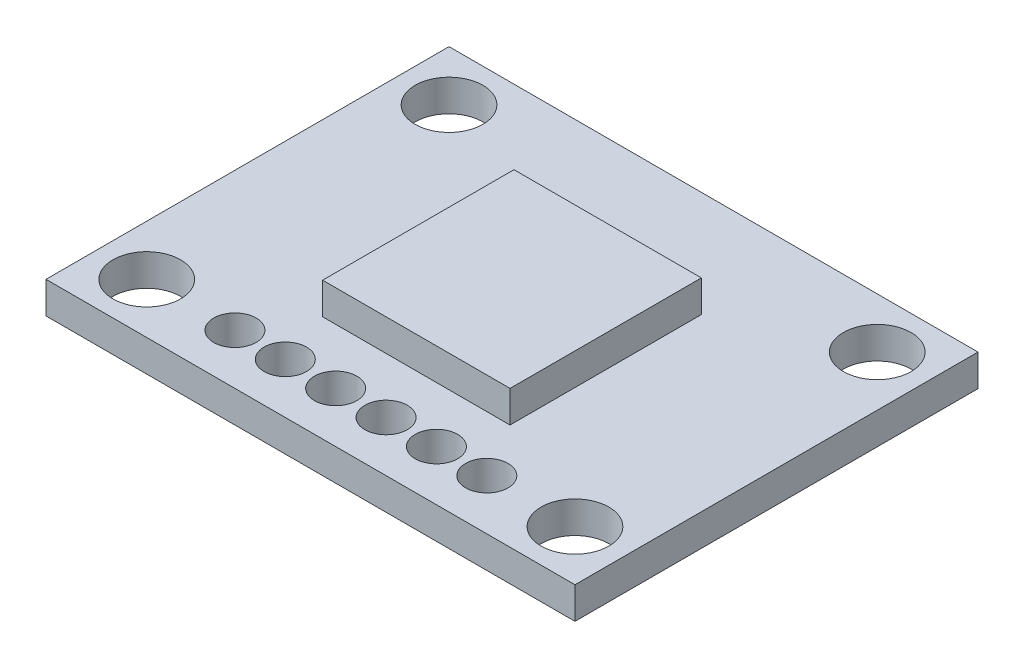
ISO-10303-21;
HEADER;
FILE_DESCRIPTION(('STEP AP214'),'2;1');
FILE_NAME('part.step','',(''),(''),'','','');
FILE_SCHEMA(('AUTOMOTIVE_DESIGN { 1 0 10303 214 1 1 1 1 }'));
ENDSEC;
DATA;
#1=APPLICATION_CONTEXT('core data for automotive mechanical design processes');
#2=APPLICATION_PROTOCOL_DEFINITION('international standard','automotive_design',2000,#1);
#3=PRODUCT_CONTEXT('',#1,'mechanical');
#4=PRODUCT('Part','Part','',(#3));
#5=PRODUCT_RELATED_PRODUCT_CATEGORY('part','',(#4));
#6=PRODUCT_DEFINITION_FORMATION('','',#4);
#7=PRODUCT_DEFINITION_CONTEXT('part definition',#1,'design');
#8=PRODUCT_DEFINITION('design','',#6,#7);
#9=PRODUCT_DEFINITION_SHAPE('','',#8);
#10=(LENGTH_UNIT() NAMED_UNIT(*) SI_UNIT(.MILLI.,.METRE.));
#11=(NAMED_UNIT(*) PLANE_ANGLE_UNIT() SI_UNIT($,.RADIAN.));
#12=(NAMED_UNIT(*) SI_UNIT($,.STERADIAN.) SOLID_ANGLE_UNIT());
#13=UNCERTAINTY_MEASURE_WITH_UNIT(LENGTH_MEASURE(1.E-05),#10,'distance_accuracy_value','');
#14=(GEOMETRIC_REPRESENTATION_CONTEXT(3) GLOBAL_UNCERTAINTY_ASSIGNED_CONTEXT((#13)) GLOBAL_UNIT_ASSIGNED_CONTEXT((#10,
#11,#12)) REPRESENTATION_CONTEXT('',''));
#15=CARTESIAN_POINT('',(0.,0.,0.));
#16=DIRECTION('',(0.,0.,1.));
#17=DIRECTION('',(1.,0.,0.));
#18=AXIS2_PLACEMENT_3D('',#15,#16,#17);
#19=CARTESIAN_POINT('',(0.,1.6,0.));
#20=DIRECTION('',(0.,-1.,0.));
#21=DIRECTION('',(0.,0.,-1.));
#22=AXIS2_PLACEMENT_3D('',#19,#20,#21);
#23=PLANE('',#22);
#24=CARTESIAN_POINT('',(1.27,1.6,7.61999999999999));
#25=DIRECTION('',(0.,1.,0.));
#26=DIRECTION('',(0.,0.,-1.));
#27=AXIS2_PLACEMENT_3D('',#24,#25,#26);
#28=CIRCLE('',#27,1.06997980980528);
#29=CARTESIAN_POINT('',(1.27,1.6,6.5500201901947));
#30=VERTEX_POINT('',#29);
#31=EDGE_CURVE('E122',#30,#30,#28,.T.);
#32=ORIENTED_EDGE('',*,*,#31,.F.);
#33=EDGE_LOOP('',(#32));
#34=FACE_BOUND('',#33,.T.);
#35=CARTESIAN_POINT('',(3.81,1.6,7.62));
#36=DIRECTION('',(0.,1.,0.));
#37=DIRECTION('',(0.,0.,-1.));
#38=AXIS2_PLACEMENT_3D('',#35,#36,#37);
#39=CIRCLE('',#38,1.06997980980528);
#40=CARTESIAN_POINT('',(3.81,1.6,6.55002019019472));
#41=VERTEX_POINT('',#40);
#42=EDGE_CURVE('E131',#41,#41,#39,.T.);
#43=ORIENTED_EDGE('',*,*,#42,.F.);
#44=EDGE_LOOP('',(#43));
#45=FACE_BOUND('',#44,.T.);
#46=CARTESIAN_POINT('',(-6.35,1.6,7.62000000000002));
#47=DIRECTION('',(0.,1.,0.));
#48=DIRECTION('',(0.,0.,1.));
#49=AXIS2_PLACEMENT_3D('',#46,#47,#48);
#50=CIRCLE('',#49,1.06997980980528);
#51=CARTESIAN_POINT('',(-6.35,1.6,8.6899798098053));
#52=VERTEX_POINT('',#51);
#53=EDGE_CURVE('E137',#52,#52,#50,.T.);
#54=ORIENTED_EDGE('',*,*,#53,.F.);
#55=EDGE_LOOP('',(#54));
#56=FACE_BOUND('',#55,.T.);
#57=CARTESIAN_POINT('',(-3.81,1.6,7.62));
#58=DIRECTION('',(0.,1.,0.));
#59=DIRECTION('',(0.,0.,1.));
#60=AXIS2_PLACEMENT_3D('',#57,#58,#59);
#61=CIRCLE('',#60,1.06997980980528);
#62=CARTESIAN_POINT('',(-3.81,1.6,8.68997980980529));
#63=VERTEX_POINT('',#62);
#64=EDGE_CURVE('E143',#63,#63,#61,.T.);
#65=ORIENTED_EDGE('',*,*,#64,.F.);
#66=EDGE_LOOP('',(#65));
#67=FACE_BOUND('',#66,.T.);
#68=CARTESIAN_POINT('',(6.35,1.6,7.62000000000002));
#69=DIRECTION('',(0.,1.,0.));
#70=DIRECTION('',(0.,0.,-1.));
#71=AXIS2_PLACEMENT_3D('',#68,#69,#70);
#72=CIRCLE('',#71,1.06997980980528);
#73=CARTESIAN_POINT('',(6.35,1.6,6.55002019019474));
#74=VERTEX_POINT('',#73);
#75=EDGE_CURVE('E149',#74,#74,#72,.T.);
#76=ORIENTED_EDGE('',*,*,#75,.F.);
#77=EDGE_LOOP('',(#76));
#78=FACE_BOUND('',#77,.T.);
#79=CARTESIAN_POINT('',(-1.27,1.6,7.61999999999999));
#80=DIRECTION('',(0.,1.,0.));
#81=DIRECTION('',(0.,0.,1.));
#82=AXIS2_PLACEMENT_3D('',#79,#80,#81);
#83=CIRCLE('',#82,1.06997980980528);
#84=CARTESIAN_POINT('',(-1.27,1.6,8.68997980980527));
#85=VERTEX_POINT('',#84);
#86=EDGE_CURVE('E155',#85,#85,#83,.T.);
#87=ORIENTED_EDGE('',*,*,#86,.F.);
#88=EDGE_LOOP('',(#87));
#89=FACE_BOUND('',#88,.T.);
#90=CARTESIAN_POINT('',(-10.795,1.6,7.61999999999999));
#91=DIRECTION('',(0.,1.,0.));
#92=DIRECTION('',(0.,0.,-1.));
#93=AXIS2_PLACEMENT_3D('',#90,#91,#92);
#94=CIRCLE('',#93,1.70781809242809);
#95=CARTESIAN_POINT('',(-10.795,1.6,5.91218190757189));
#96=VERTEX_POINT('',#95);
#97=EDGE_CURVE('E161',#96,#96,#94,.T.);
#98=ORIENTED_EDGE('',*,*,#97,.F.);
#99=EDGE_LOOP('',(#98));
#100=FACE_BOUND('',#99,.T.);
#101=CARTESIAN_POINT('',(10.795,1.6,7.62));
#102=DIRECTION('',(0.,1.,0.));
#103=DIRECTION('',(0.,0.,1.));
#104=AXIS2_PLACEMENT_3D('',#101,#102,#103);
#105=CIRCLE('',#104,1.70781809242809);
#106=CARTESIAN_POINT('',(10.795,1.6,9.32781809242809));
#107=VERTEX_POINT('',#106);
#108=EDGE_CURVE('E167',#107,#107,#105,.T.);
#109=ORIENTED_EDGE('',*,*,#108,.F.);
#110=EDGE_LOOP('',(#109));
#111=FACE_BOUND('',#110,.T.);
#112=CARTESIAN_POINT('',(10.795,1.6,-7.62));
#113=DIRECTION('',(0.,1.,0.));
#114=DIRECTION('',(0.,0.,-1.));
#115=AXIS2_PLACEMENT_3D('',#112,#113,#114);
#116=CIRCLE('',#115,1.70781809242809);
#117=CARTESIAN_POINT('',(10.795,1.6,-9.32781809242809));
#118=VERTEX_POINT('',#117);
#119=EDGE_CURVE('E173',#118,#118,#116,.T.);
#120=ORIENTED_EDGE('',*,*,#119,.F.);
#121=EDGE_LOOP('',(#120));
#122=FACE_BOUND('',#121,.T.);
#123=CARTESIAN_POINT('',(-10.795,1.6,-7.62));
#124=DIRECTION('',(0.,1.,0.));
#125=DIRECTION('',(0.,0.,1.));
#126=AXIS2_PLACEMENT_3D('',#123,#124,#125);
#127=CIRCLE('',#126,1.70781809242809);
#128=CARTESIAN_POINT('',(-10.795,1.6,-5.91218190757191));
#129=VERTEX_POINT('',#128);
#130=EDGE_CURVE('E179',#129,#129,#127,.T.);
#131=ORIENTED_EDGE('',*,*,#130,.F.);
#132=EDGE_LOOP('',(#131));
#133=FACE_BOUND('',#132,.T.);
#134=DIRECTION('',(0.,0.,-1.));
#135=VECTOR('',#134,1.);
#136=CARTESIAN_POINT('',(13.335,1.6,10.16));
#137=LINE('',#136,#135);
#138=CARTESIAN_POINT('',(13.335,1.6,10.16));
#139=VERTEX_POINT('',#138);
#140=CARTESIAN_POINT('',(13.335,1.6,-10.16));
#141=VERTEX_POINT('',#140);
#142=EDGE_CURVE('E185',#139,#141,#137,.T.);
#143=ORIENTED_EDGE('',*,*,#142,.T.);
#144=DIRECTION('',(-1.,0.,0.));
#145=VECTOR('',#144,1.);
#146=CARTESIAN_POINT('',(-13.335,1.6,-10.16));
#147=LINE('',#146,#145);
#148=CARTESIAN_POINT('',(-13.335,1.6,-10.16));
#149=VERTEX_POINT('',#148);
#150=EDGE_CURVE('E188',#141,#149,#147,.T.);
#151=ORIENTED_EDGE('',*,*,#150,.T.);
#152=DIRECTION('',(0.,0.,1.));
#153=VECTOR('',#152,1.);
#154=CARTESIAN_POINT('',(-13.335,1.6,10.16));
#155=LINE('',#154,#153);
#156=CARTESIAN_POINT('',(-13.335,1.6,10.16));
#157=VERTEX_POINT('',#156);
#158=EDGE_CURVE('E191',#149,#157,#155,.T.);
#159=ORIENTED_EDGE('',*,*,#158,.T.);
#160=DIRECTION('',(1.,0.,0.));
#161=VECTOR('',#160,1.);
#162=CARTESIAN_POINT('',(-13.335,1.6,10.16));
#163=LINE('',#162,#161);
#164=EDGE_CURVE('E193',#157,#139,#163,.T.);
#165=ORIENTED_EDGE('',*,*,#164,.T.);
#166=EDGE_LOOP('',(#143,#151,#159,#165));
#167=FACE_BOUND('',#166,.T.);
#168=DIRECTION('',(0.,0.,-1.));
#169=VECTOR('',#168,1.);
#170=CARTESIAN_POINT('',(4.72486367333325,1.6,4.82363423025589));
#171=LINE('',#170,#169);
#172=CARTESIAN_POINT('',(4.72486367333325,1.6,4.82363423025589));
#173=VERTEX_POINT('',#172);
#174=CARTESIAN_POINT('',(4.72486367333325,1.6,-4.82363423025589));
#175=VERTEX_POINT('',#174);
#176=EDGE_CURVE('E49',#173,#175,#171,.T.);
#177=ORIENTED_EDGE('',*,*,#176,.F.);
#178=DIRECTION('',(1.,0.,0.));
#179=VECTOR('',#178,1.);
#180=CARTESIAN_POINT('',(-4.72486367333325,1.6,4.82363423025589));
#181=LINE('',#180,#179);
#182=CARTESIAN_POINT('',(-4.72486367333325,1.6,4.82363423025589));
#183=VERTEX_POINT('',#182);
#184=EDGE_CURVE('E53',#183,#173,#181,.T.);
#185=ORIENTED_EDGE('',*,*,#184,.F.);
#186=DIRECTION('',(0.,0.,1.));
#187=VECTOR('',#186,1.);
#188=CARTESIAN_POINT('',(-4.72486367333325,1.6,4.82363423025589));
#189=LINE('',#188,#187);
#190=CARTESIAN_POINT('',(-4.72486367333325,1.6,-4.82363423025589));
#191=VERTEX_POINT('',#190);
#192=EDGE_CURVE('E432',#191,#183,#189,.T.);
#193=ORIENTED_EDGE('',*,*,#192,.F.);
#194=DIRECTION('',(-1.,0.,0.));
#195=VECTOR('',#194,1.);
#196=CARTESIAN_POINT('',(-4.72486367333325,1.6,-4.82363423025589));
#197=LINE('',#196,#195);
#198=EDGE_CURVE('E438',#175,#191,#197,.T.);
#199=ORIENTED_EDGE('',*,*,#198,.F.);
#200=EDGE_LOOP('',(#177,#185,#193,#199));
#201=FACE_BOUND('',#200,.T.);
#202=ADVANCED_FACE('F34',(#34,#45,#56,#67,#78,#89,#100,#111,#122,#133,#167,#201),#23,.F.);
#203=CARTESIAN_POINT('',(0.,0.,0.));
#204=DIRECTION('',(0.,-1.,0.));
#205=DIRECTION('',(0.,0.,-1.));
#206=AXIS2_PLACEMENT_3D('',#203,#204,#205);
#207=PLANE('',#206);
#208=CARTESIAN_POINT('',(3.81,0.,7.62));
#209=DIRECTION('',(0.,1.,0.));
#210=DIRECTION('',(0.,0.,-1.));
#211=AXIS2_PLACEMENT_3D('',#208,#209,#210);
#212=CIRCLE('',#211,1.06997980980528);
#213=CARTESIAN_POINT('',(3.81,0.,6.55002019019472));
#214=VERTEX_POINT('',#213);
#215=EDGE_CURVE('E129',#214,#214,#212,.T.);
#216=ORIENTED_EDGE('',*,*,#215,.T.);
#217=EDGE_LOOP('',(#216));
#218=FACE_BOUND('',#217,.T.);
#219=CARTESIAN_POINT('',(-3.81,0.,7.62));
#220=DIRECTION('',(0.,1.,0.));
#221=DIRECTION('',(0.,0.,1.));
#222=AXIS2_PLACEMENT_3D('',#219,#220,#221);
#223=CIRCLE('',#222,1.06997980980528);
#224=CARTESIAN_POINT('',(-3.81,0.,8.68997980980529));
#225=VERTEX_POINT('',#224);
#226=EDGE_CURVE('E140',#225,#225,#223,.T.);
#227=ORIENTED_EDGE('',*,*,#226,.T.);
#228=EDGE_LOOP('',(#227));
#229=FACE_BOUND('',#228,.T.);
#230=CARTESIAN_POINT('',(-1.27,0.,7.61999999999999));
#231=DIRECTION('',(0.,1.,0.));
#232=DIRECTION('',(0.,0.,1.));
#233=AXIS2_PLACEMENT_3D('',#230,#231,#232);
#234=CIRCLE('',#233,1.06997980980528);
#235=CARTESIAN_POINT('',(-1.27,0.,8.68997980980527));
#236=VERTEX_POINT('',#235);
#237=EDGE_CURVE('E152',#236,#236,#234,.T.);
#238=ORIENTED_EDGE('',*,*,#237,.T.);
#239=EDGE_LOOP('',(#238));
#240=FACE_BOUND('',#239,.T.);
#241=CARTESIAN_POINT('',(10.795,0.,7.62));
#242=DIRECTION('',(0.,1.,0.));
#243=DIRECTION('',(0.,0.,1.));
#244=AXIS2_PLACEMENT_3D('',#241,#242,#243);
#245=CIRCLE('',#244,1.70781809242809);
#246=CARTESIAN_POINT('',(10.795,0.,9.32781809242809));
#247=VERTEX_POINT('',#246);
#248=EDGE_CURVE('E164',#247,#247,#245,.T.);
#249=ORIENTED_EDGE('',*,*,#248,.T.);
#250=EDGE_LOOP('',(#249));
#251=FACE_BOUND('',#250,.T.);
#252=CARTESIAN_POINT('',(-10.795,0.,-7.62));
#253=DIRECTION('',(0.,1.,0.));
#254=DIRECTION('',(0.,0.,1.));
#255=AXIS2_PLACEMENT_3D('',#252,#253,#254);
#256=CIRCLE('',#255,1.70781809242809);
#257=CARTESIAN_POINT('',(-10.795,0.,-5.91218190757191));
#258=VERTEX_POINT('',#257);
#259=EDGE_CURVE('E176',#258,#258,#256,.T.);
#260=ORIENTED_EDGE('',*,*,#259,.T.);
#261=EDGE_LOOP('',(#260));
#262=FACE_BOUND('',#261,.T.);
#263=DIRECTION('',(0.,0.,-1.));
#264=VECTOR('',#263,1.);
#265=CARTESIAN_POINT('',(13.335,0.,10.16));
#266=LINE('',#265,#264);
#267=CARTESIAN_POINT('',(13.335,0.,10.16));
#268=VERTEX_POINT('',#267);
#269=CARTESIAN_POINT('',(13.335,0.,-10.16));
#270=VERTEX_POINT('',#269);
#271=EDGE_CURVE('E182',#268,#270,#266,.T.);
#272=ORIENTED_EDGE('',*,*,#271,.F.);
#273=DIRECTION('',(1.,0.,0.));
#274=VECTOR('',#273,1.);
#275=CARTESIAN_POINT('',(-13.335,0.,10.16));
#276=LINE('',#275,#274);
#277=CARTESIAN_POINT('',(-13.335,0.,10.16));
#278=VERTEX_POINT('',#277);
#279=EDGE_CURVE('E189',#278,#268,#276,.T.);
#280=ORIENTED_EDGE('',*,*,#279,.F.);
#281=DIRECTION('',(0.,0.,1.));
#282=VECTOR('',#281,1.);
#283=CARTESIAN_POINT('',(-13.335,0.,10.16));
#284=LINE('',#283,#282);
#285=CARTESIAN_POINT('',(-13.335,0.,-10.16));
#286=VERTEX_POINT('',#285);
#287=EDGE_CURVE('E200',#286,#278,#284,.T.);
#288=ORIENTED_EDGE('',*,*,#287,.F.);
#289=DIRECTION('',(-1.,0.,0.));
#290=VECTOR('',#289,1.);
#291=CARTESIAN_POINT('',(-13.335,0.,-10.16));
#292=LINE('',#291,#290);
#293=EDGE_CURVE('E198',#270,#286,#292,.T.);
#294=ORIENTED_EDGE('',*,*,#293,.F.);
#295=EDGE_LOOP('',(#272,#280,#288,#294));
#296=FACE_BOUND('',#295,.T.);
#297=CARTESIAN_POINT('',(10.795,0.,-7.62));
#298=DIRECTION('',(0.,1.,0.));
#299=DIRECTION('',(0.,0.,-1.));
#300=AXIS2_PLACEMENT_3D('',#297,#298,#299);
#301=CIRCLE('',#300,1.70781809242809);
#302=CARTESIAN_POINT('',(10.795,0.,-9.32781809242809));
#303=VERTEX_POINT('',#302);
#304=EDGE_CURVE('E170',#303,#303,#301,.T.);
#305=ORIENTED_EDGE('',*,*,#304,.T.);
#306=EDGE_LOOP('',(#305));
#307=FACE_BOUND('',#306,.T.);
#308=CARTESIAN_POINT('',(-10.795,0.,7.61999999999999));
#309=DIRECTION('',(0.,1.,0.));
#310=DIRECTION('',(0.,0.,-1.));
#311=AXIS2_PLACEMENT_3D('',#308,#309,#310);
#312=CIRCLE('',#311,1.70781809242809);
#313=CARTESIAN_POINT('',(-10.795,0.,5.91218190757189));
#314=VERTEX_POINT('',#313);
#315=EDGE_CURVE('E158',#314,#314,#312,.T.);
#316=ORIENTED_EDGE('',*,*,#315,.T.);
#317=EDGE_LOOP('',(#316));
#318=FACE_BOUND('',#317,.T.);
#319=CARTESIAN_POINT('',(6.35,0.,7.62000000000002));
#320=DIRECTION('',(0.,1.,0.));
#321=DIRECTION('',(0.,0.,-1.));
#322=AXIS2_PLACEMENT_3D('',#319,#320,#321);
#323=CIRCLE('',#322,1.06997980980528);
#324=CARTESIAN_POINT('',(6.35,0.,6.55002019019474));
#325=VERTEX_POINT('',#324);
#326=EDGE_CURVE('E146',#325,#325,#323,.T.);
#327=ORIENTED_EDGE('',*,*,#326,.T.);
#328=EDGE_LOOP('',(#327));
#329=FACE_BOUND('',#328,.T.);
#330=CARTESIAN_POINT('',(-6.35,0.,7.62000000000002));
#331=DIRECTION('',(0.,1.,0.));
#332=DIRECTION('',(0.,0.,1.));
#333=AXIS2_PLACEMENT_3D('',#330,#331,#332);
#334=CIRCLE('',#333,1.06997980980528);
#335=CARTESIAN_POINT('',(-6.35,0.,8.6899798098053));
#336=VERTEX_POINT('',#335);
#337=EDGE_CURVE('E134',#336,#336,#334,.T.);
#338=ORIENTED_EDGE('',*,*,#337,.T.);
#339=EDGE_LOOP('',(#338));
#340=FACE_BOUND('',#339,.T.);
#341=CARTESIAN_POINT('',(1.27,0.,7.61999999999999));
#342=DIRECTION('',(0.,1.,0.));
#343=DIRECTION('',(0.,0.,-1.));
#344=AXIS2_PLACEMENT_3D('',#341,#342,#343);
#345=CIRCLE('',#344,1.06997980980528);
#346=CARTESIAN_POINT('',(1.27,0.,6.5500201901947));
#347=VERTEX_POINT('',#346);
#348=EDGE_CURVE('E119',#347,#347,#345,.T.);
#349=ORIENTED_EDGE('',*,*,#348,.T.);
#350=EDGE_LOOP('',(#349));
#351=FACE_BOUND('',#350,.T.);
#352=ADVANCED_FACE('F218',(#218,#229,#240,#251,#262,#296,#307,#318,#329,#340,#351),#207,.T.);
#353=CARTESIAN_POINT('',(13.335,1.6,10.16));
#354=DIRECTION('',(-1.,0.,0.));
#355=DIRECTION('',(0.,0.,1.));
#356=AXIS2_PLACEMENT_3D('',#353,#354,#355);
#357=PLANE('',#356);
#358=ORIENTED_EDGE('',*,*,#271,.T.);
#359=DIRECTION('',(0.,-1.,0.));
#360=VECTOR('',#359,1.);
#361=CARTESIAN_POINT('',(13.335,1.6,-10.16));
#362=LINE('',#361,#360);
#363=EDGE_CURVE('E11',#141,#270,#362,.T.);
#364=ORIENTED_EDGE('',*,*,#363,.F.);
#365=ORIENTED_EDGE('',*,*,#142,.F.);
#366=DIRECTION('',(0.,-1.,0.));
#367=VECTOR('',#366,1.);
#368=CARTESIAN_POINT('',(13.335,1.6,10.16));
#369=LINE('',#368,#367);
#370=EDGE_CURVE('E195',#139,#268,#369,.T.);
#371=ORIENTED_EDGE('',*,*,#370,.T.);
#372=EDGE_LOOP('',(#358,#364,#365,#371));
#373=FACE_BOUND('',#372,.T.);
#374=ADVANCED_FACE('F36',(#373),#357,.F.);
#375=CARTESIAN_POINT('',(-13.335,1.6,-10.16));
#376=DIRECTION('',(0.,0.,1.));
#377=DIRECTION('',(1.,0.,0.));
#378=AXIS2_PLACEMENT_3D('',#375,#376,#377);
#379=PLANE('',#378);
#380=ORIENTED_EDGE('',*,*,#293,.T.);
#381=DIRECTION('',(0.,-1.,0.));
#382=VECTOR('',#381,1.);
#383=CARTESIAN_POINT('',(-13.335,1.6,-10.16));
#384=LINE('',#383,#382);
#385=EDGE_CURVE('E42',#149,#286,#384,.T.);
#386=ORIENTED_EDGE('',*,*,#385,.F.);
#387=ORIENTED_EDGE('',*,*,#150,.F.);
#388=ORIENTED_EDGE('',*,*,#363,.T.);
#389=EDGE_LOOP('',(#380,#386,#387,#388));
#390=FACE_BOUND('',#389,.T.);
#391=ADVANCED_FACE('F228',(#390),#379,.F.);
#392=CARTESIAN_POINT('',(-13.335,1.6,10.16));
#393=DIRECTION('',(1.,0.,0.));
#394=DIRECTION('',(0.,0.,-1.));
#395=AXIS2_PLACEMENT_3D('',#392,#393,#394);
#396=PLANE('',#395);
#397=ORIENTED_EDGE('',*,*,#287,.T.);
#398=DIRECTION('',(0.,-1.,0.));
#399=VECTOR('',#398,1.);
#400=CARTESIAN_POINT('',(-13.335,1.6,10.16));
#401=LINE('',#400,#399);
#402=EDGE_CURVE('E205',#157,#278,#401,.T.);
#403=ORIENTED_EDGE('',*,*,#402,.F.);
#404=ORIENTED_EDGE('',*,*,#158,.F.);
#405=ORIENTED_EDGE('',*,*,#385,.T.);
#406=EDGE_LOOP('',(#397,#403,#404,#405));
#407=FACE_BOUND('',#406,.T.);
#408=ADVANCED_FACE('F212',(#407),#396,.F.);
#409=CARTESIAN_POINT('',(-13.335,1.6,10.16));
#410=DIRECTION('',(0.,0.,-1.));
#411=DIRECTION('',(-1.,0.,0.));
#412=AXIS2_PLACEMENT_3D('',#409,#410,#411);
#413=PLANE('',#412);
#414=ORIENTED_EDGE('',*,*,#279,.T.);
#415=ORIENTED_EDGE('',*,*,#370,.F.);
#416=ORIENTED_EDGE('',*,*,#164,.F.);
#417=ORIENTED_EDGE('',*,*,#402,.T.);
#418=EDGE_LOOP('',(#414,#415,#416,#417));
#419=FACE_BOUND('',#418,.T.);
#420=ADVANCED_FACE('F222',(#419),#413,.F.);
#421=CARTESIAN_POINT('',(-10.795,1.6,-7.62));
#422=DIRECTION('',(0.,-1.,0.));
#423=DIRECTION('',(0.,0.,-1.));
#424=AXIS2_PLACEMENT_3D('',#421,#422,#423);
#425=CYLINDRICAL_SURFACE('',#424,1.70781809242809);
#426=ORIENTED_EDGE('',*,*,#130,.T.);
#427=EDGE_LOOP('',(#426));
#428=FACE_BOUND('',#427,.T.);
#429=ORIENTED_EDGE('',*,*,#259,.F.);
#430=EDGE_LOOP('',(#429));
#431=FACE_BOUND('',#430,.T.);
#432=ADVANCED_FACE('F246',(#428,#431),#425,.F.);
#433=CARTESIAN_POINT('',(10.795,1.6,-7.62));
#434=DIRECTION('',(0.,-1.,0.));
#435=DIRECTION('',(0.,0.,-1.));
#436=AXIS2_PLACEMENT_3D('',#433,#434,#435);
#437=CYLINDRICAL_SURFACE('',#436,1.70781809242809);
#438=ORIENTED_EDGE('',*,*,#119,.T.);
#439=EDGE_LOOP('',(#438));
#440=FACE_BOUND('',#439,.T.);
#441=ORIENTED_EDGE('',*,*,#304,.F.);
#442=EDGE_LOOP('',(#441));
#443=FACE_BOUND('',#442,.T.);
#444=ADVANCED_FACE('F253',(#440,#443),#437,.F.);
#445=CARTESIAN_POINT('',(10.795,1.6,7.62));
#446=DIRECTION('',(0.,-1.,0.));
#447=DIRECTION('',(0.,0.,-1.));
#448=AXIS2_PLACEMENT_3D('',#445,#446,#447);
#449=CYLINDRICAL_SURFACE('',#448,1.70781809242809);
#450=ORIENTED_EDGE('',*,*,#108,.T.);
#451=EDGE_LOOP('',(#450));
#452=FACE_BOUND('',#451,.T.);
#453=ORIENTED_EDGE('',*,*,#248,.F.);
#454=EDGE_LOOP('',(#453));
#455=FACE_BOUND('',#454,.T.);
#456=ADVANCED_FACE('F258',(#452,#455),#449,.F.);
#457=CARTESIAN_POINT('',(-10.795,1.6,7.61999999999999));
#458=DIRECTION('',(0.,-1.,0.));
#459=DIRECTION('',(0.,0.,-1.));
#460=AXIS2_PLACEMENT_3D('',#457,#458,#459);
#461=CYLINDRICAL_SURFACE('',#460,1.70781809242809);
#462=ORIENTED_EDGE('',*,*,#97,.T.);
#463=EDGE_LOOP('',(#462));
#464=FACE_BOUND('',#463,.T.);
#465=ORIENTED_EDGE('',*,*,#315,.F.);
#466=EDGE_LOOP('',(#465));
#467=FACE_BOUND('',#466,.T.);
#468=ADVANCED_FACE('F268',(#464,#467),#461,.F.);
#469=CARTESIAN_POINT('',(-1.27,1.6,7.61999999999999));
#470=DIRECTION('',(0.,-1.,0.));
#471=DIRECTION('',(0.,0.,-1.));
#472=AXIS2_PLACEMENT_3D('',#469,#470,#471);
#473=CYLINDRICAL_SURFACE('',#472,1.06997980980528);
#474=ORIENTED_EDGE('',*,*,#86,.T.);
#475=EDGE_LOOP('',(#474));
#476=FACE_BOUND('',#475,.T.);
#477=ORIENTED_EDGE('',*,*,#237,.F.);
#478=EDGE_LOOP('',(#477));
#479=FACE_BOUND('',#478,.T.);
#480=ADVANCED_FACE('F275',(#476,#479),#473,.F.);
#481=CARTESIAN_POINT('',(6.35,1.6,7.62000000000002));
#482=DIRECTION('',(0.,-1.,0.));
#483=DIRECTION('',(0.,0.,-1.));
#484=AXIS2_PLACEMENT_3D('',#481,#482,#483);
#485=CYLINDRICAL_SURFACE('',#484,1.06997980980528);
#486=ORIENTED_EDGE('',*,*,#75,.T.);
#487=EDGE_LOOP('',(#486));
#488=FACE_BOUND('',#487,.T.);
#489=ORIENTED_EDGE('',*,*,#326,.F.);
#490=EDGE_LOOP('',(#489));
#491=FACE_BOUND('',#490,.T.);
#492=ADVANCED_FACE('F279',(#488,#491),#485,.F.);
#493=CARTESIAN_POINT('',(-3.81,1.6,7.62));
#494=DIRECTION('',(0.,-1.,0.));
#495=DIRECTION('',(0.,0.,-1.));
#496=AXIS2_PLACEMENT_3D('',#493,#494,#495);
#497=CYLINDRICAL_SURFACE('',#496,1.06997980980528);
#498=ORIENTED_EDGE('',*,*,#64,.T.);
#499=EDGE_LOOP('',(#498));
#500=FACE_BOUND('',#499,.T.);
#501=ORIENTED_EDGE('',*,*,#226,.F.);
#502=EDGE_LOOP('',(#501));
#503=FACE_BOUND('',#502,.T.);
#504=ADVANCED_FACE('F283',(#500,#503),#497,.F.);
#505=CARTESIAN_POINT('',(-6.35,1.6,7.62000000000002));
#506=DIRECTION('',(0.,-1.,0.));
#507=DIRECTION('',(0.,0.,-1.));
#508=AXIS2_PLACEMENT_3D('',#505,#506,#507);
#509=CYLINDRICAL_SURFACE('',#508,1.06997980980528);
#510=ORIENTED_EDGE('',*,*,#53,.T.);
#511=EDGE_LOOP('',(#510));
#512=FACE_BOUND('',#511,.T.);
#513=ORIENTED_EDGE('',*,*,#337,.F.);
#514=EDGE_LOOP('',(#513));
#515=FACE_BOUND('',#514,.T.);
#516=ADVANCED_FACE('F287',(#512,#515),#509,.F.);
#517=CARTESIAN_POINT('',(3.81,1.6,7.62));
#518=DIRECTION('',(0.,-1.,0.));
#519=DIRECTION('',(0.,0.,-1.));
#520=AXIS2_PLACEMENT_3D('',#517,#518,#519);
#521=CYLINDRICAL_SURFACE('',#520,1.06997980980528);
#522=ORIENTED_EDGE('',*,*,#42,.T.);
#523=EDGE_LOOP('',(#522));
#524=FACE_BOUND('',#523,.T.);
#525=ORIENTED_EDGE('',*,*,#215,.F.);
#526=EDGE_LOOP('',(#525));
#527=FACE_BOUND('',#526,.T.);
#528=ADVANCED_FACE('F291',(#524,#527),#521,.F.);
#529=CARTESIAN_POINT('',(1.27,1.6,7.61999999999999));
#530=DIRECTION('',(0.,-1.,0.));
#531=DIRECTION('',(0.,0.,-1.));
#532=AXIS2_PLACEMENT_3D('',#529,#530,#531);
#533=CYLINDRICAL_SURFACE('',#532,1.06997980980528);
#534=ORIENTED_EDGE('',*,*,#31,.T.);
#535=EDGE_LOOP('',(#534));
#536=FACE_BOUND('',#535,.T.);
#537=ORIENTED_EDGE('',*,*,#348,.F.);
#538=EDGE_LOOP('',(#537));
#539=FACE_BOUND('',#538,.T.);
#540=ADVANCED_FACE('F295',(#536,#539),#533,.F.);
#541=CARTESIAN_POINT('',(4.72486367333325,3.2,4.82363423025589));
#542=DIRECTION('',(-1.,0.,0.));
#543=DIRECTION('',(0.,0.,1.));
#544=AXIS2_PLACEMENT_3D('',#541,#542,#543);
#545=PLANE('',#544);
#546=ORIENTED_EDGE('',*,*,#176,.T.);
#547=DIRECTION('',(0.,-1.,0.));
#548=VECTOR('',#547,1.);
#549=CARTESIAN_POINT('',(4.72486367333325,3.2,-4.82363423025589));
#550=LINE('',#549,#548);
#551=CARTESIAN_POINT('',(4.72486367333325,3.2,-4.82363423025589));
#552=VERTEX_POINT('',#551);
#553=EDGE_CURVE('E102',#552,#175,#550,.T.);
#554=ORIENTED_EDGE('',*,*,#553,.F.);
#555=DIRECTION('',(0.,0.,-1.));
#556=VECTOR('',#555,1.);
#557=CARTESIAN_POINT('',(4.72486367333325,3.2,4.82363423025589));
#558=LINE('',#557,#556);
#559=CARTESIAN_POINT('',(4.72486367333325,3.2,4.82363423025589));
#560=VERTEX_POINT('',#559);
#561=EDGE_CURVE('E108',#560,#552,#558,.T.);
#562=ORIENTED_EDGE('',*,*,#561,.F.);
#563=DIRECTION('',(0.,-1.,0.));
#564=VECTOR('',#563,1.);
#565=CARTESIAN_POINT('',(4.72486367333325,3.2,4.82363423025589));
#566=LINE('',#565,#564);
#567=EDGE_CURVE('E430',#560,#173,#566,.T.);
#568=ORIENTED_EDGE('',*,*,#567,.T.);
#569=EDGE_LOOP('',(#546,#554,#562,#568));
#570=FACE_BOUND('',#569,.T.);
#571=ADVANCED_FACE('F118',(#570),#545,.F.);
#572=CARTESIAN_POINT('',(-4.72486367333325,3.2,-4.82363423025589));
#573=DIRECTION('',(0.,0.,1.));
#574=DIRECTION('',(1.,0.,0.));
#575=AXIS2_PLACEMENT_3D('',#572,#573,#574);
#576=PLANE('',#575);
#577=ORIENTED_EDGE('',*,*,#198,.T.);
#578=DIRECTION('',(0.,-1.,0.));
#579=VECTOR('',#578,1.);
#580=CARTESIAN_POINT('',(-4.72486367333325,3.2,-4.82363423025589));
#581=LINE('',#580,#579);
#582=CARTESIAN_POINT('',(-4.72486367333325,3.2,-4.82363423025589));
#583=VERTEX_POINT('',#582);
#584=EDGE_CURVE('E104',#583,#191,#581,.T.);
#585=ORIENTED_EDGE('',*,*,#584,.F.);
#586=DIRECTION('',(-1.,0.,0.));
#587=VECTOR('',#586,1.);
#588=CARTESIAN_POINT('',(-4.72486367333325,3.2,-4.82363423025589));
#589=LINE('',#588,#587);
#590=EDGE_CURVE('E97',#552,#583,#589,.T.);
#591=ORIENTED_EDGE('',*,*,#590,.F.);
#592=ORIENTED_EDGE('',*,*,#553,.T.);
#593=EDGE_LOOP('',(#577,#585,#591,#592));
#594=FACE_BOUND('',#593,.T.);
#595=ADVANCED_FACE('F100',(#594),#576,.F.);
#596=CARTESIAN_POINT('',(-4.72486367333325,3.2,4.82363423025589));
#597=DIRECTION('',(1.,0.,0.));
#598=DIRECTION('',(0.,0.,-1.));
#599=AXIS2_PLACEMENT_3D('',#596,#597,#598);
#600=PLANE('',#599);
#601=ORIENTED_EDGE('',*,*,#192,.T.);
#602=DIRECTION('',(0.,-1.,0.));
#603=VECTOR('',#602,1.);
#604=CARTESIAN_POINT('',(-4.72486367333325,3.2,4.82363423025589));
#605=LINE('',#604,#603);
#606=CARTESIAN_POINT('',(-4.72486367333325,3.2,4.82363423025589));
#607=VERTEX_POINT('',#606);
#608=EDGE_CURVE('E124',#607,#183,#605,.T.);
#609=ORIENTED_EDGE('',*,*,#608,.F.);
#610=DIRECTION('',(0.,0.,1.));
#611=VECTOR('',#610,1.);
#612=CARTESIAN_POINT('',(-4.72486367333325,3.2,4.82363423025589));
#613=LINE('',#612,#611);
#614=EDGE_CURVE('E107',#583,#607,#613,.T.);
#615=ORIENTED_EDGE('',*,*,#614,.F.);
#616=ORIENTED_EDGE('',*,*,#584,.T.);
#617=EDGE_LOOP('',(#601,#609,#615,#616));
#618=FACE_BOUND('',#617,.T.);
#619=ADVANCED_FACE('F304',(#618),#600,.F.);
#620=CARTESIAN_POINT('',(-4.72486367333325,3.2,4.82363423025589));
#621=DIRECTION('',(0.,0.,-1.));
#622=DIRECTION('',(-1.,0.,0.));
#623=AXIS2_PLACEMENT_3D('',#620,#621,#622);
#624=PLANE('',#623);
#625=ORIENTED_EDGE('',*,*,#184,.T.);
#626=ORIENTED_EDGE('',*,*,#567,.F.);
#627=DIRECTION('',(1.,0.,0.));
#628=VECTOR('',#627,1.);
#629=CARTESIAN_POINT('',(-4.72486367333325,3.2,4.82363423025589));
#630=LINE('',#629,#628);
#631=EDGE_CURVE('E113',#607,#560,#630,.T.);
#632=ORIENTED_EDGE('',*,*,#631,.F.);
#633=ORIENTED_EDGE('',*,*,#608,.T.);
#634=EDGE_LOOP('',(#625,#626,#632,#633));
#635=FACE_BOUND('',#634,.T.);
#636=ADVANCED_FACE('F307',(#635),#624,.F.);
#637=CARTESIAN_POINT('',(0.,3.2,0.));
#638=DIRECTION('',(0.,-1.,0.));
#639=DIRECTION('',(0.,0.,-1.));
#640=AXIS2_PLACEMENT_3D('',#637,#638,#639);
#641=PLANE('',#640);
#642=ORIENTED_EDGE('',*,*,#561,.T.);
#643=ORIENTED_EDGE('',*,*,#590,.T.);
#644=ORIENTED_EDGE('',*,*,#614,.T.);
#645=ORIENTED_EDGE('',*,*,#631,.T.);
#646=EDGE_LOOP('',(#642,#643,#644,#645));
#647=FACE_BOUND('',#646,.T.);
#648=ADVANCED_FACE('F111',(#647),#641,.F.);
#649=CLOSED_SHELL('',(#202,#352,#374,#391,#408,#420,#432,#444,#456,#468,#480,#492,#504,#516,
#528,#540,#571,#595,#619,#636,#648));
#650=MANIFOLD_SOLID_BREP('B2',#649);
#651=ADVANCED_BREP_SHAPE_REPRESENTATION('',(#18,#650),#14);
#652=SHAPE_DEFINITION_REPRESENTATION(#9,#651);
ENDSEC;
END-ISO-10303-21;
